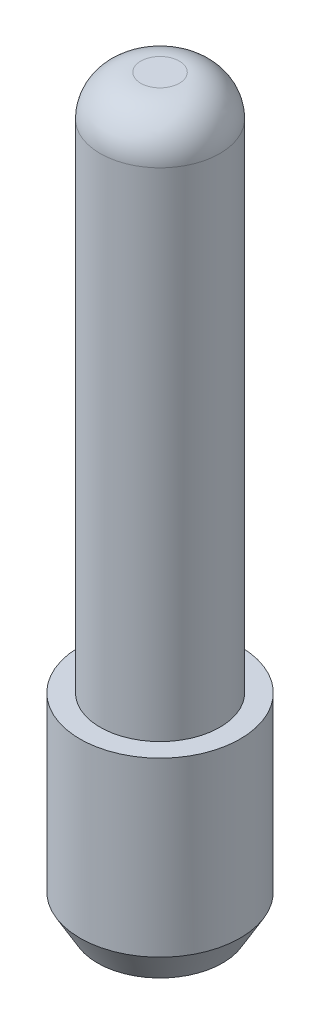
ISO-10303-21;
HEADER;
FILE_DESCRIPTION(('STEP AP214'),'2;1');
FILE_NAME('part.step','',(''),(''),'','','');
FILE_SCHEMA(('AUTOMOTIVE_DESIGN { 1 0 10303 214 1 1 1 1 }'));
ENDSEC;
DATA;
#1=APPLICATION_CONTEXT('core data for automotive mechanical design processes');
#2=APPLICATION_PROTOCOL_DEFINITION('international standard','automotive_design',2000,#1);
#3=PRODUCT_CONTEXT('',#1,'mechanical');
#4=PRODUCT('Part','Part','',(#3));
#5=PRODUCT_RELATED_PRODUCT_CATEGORY('part','',(#4));
#6=PRODUCT_DEFINITION_FORMATION('','',#4);
#7=PRODUCT_DEFINITION_CONTEXT('part definition',#1,'design');
#8=PRODUCT_DEFINITION('design','',#6,#7);
#9=PRODUCT_DEFINITION_SHAPE('','',#8);
#10=(LENGTH_UNIT() NAMED_UNIT(*) SI_UNIT(.MILLI.,.METRE.));
#11=(NAMED_UNIT(*) PLANE_ANGLE_UNIT() SI_UNIT($,.RADIAN.));
#12=(NAMED_UNIT(*) SI_UNIT($,.STERADIAN.) SOLID_ANGLE_UNIT());
#13=UNCERTAINTY_MEASURE_WITH_UNIT(LENGTH_MEASURE(1.E-05),#10,'distance_accuracy_value','');
#14=(GEOMETRIC_REPRESENTATION_CONTEXT(3) GLOBAL_UNCERTAINTY_ASSIGNED_CONTEXT((#13)) GLOBAL_UNIT_ASSIGNED_CONTEXT((#10,
#11,#12)) REPRESENTATION_CONTEXT('',''));
#15=CARTESIAN_POINT('',(0.,0.,0.));
#16=DIRECTION('',(0.,0.,1.));
#17=DIRECTION('',(1.,0.,0.));
#18=AXIS2_PLACEMENT_3D('',#15,#16,#17);
#19=CARTESIAN_POINT('',(0.,0.,0.));
#20=DIRECTION('',(0.,-1.,0.));
#21=DIRECTION('',(0.,0.,-1.));
#22=AXIS2_PLACEMENT_3D('',#19,#20,#21);
#23=PLANE('',#22);
#24=CARTESIAN_POINT('',(0.,0.,0.));
#25=DIRECTION('',(0.,-1.,0.));
#26=DIRECTION('',(0.,0.,-1.));
#27=AXIS2_PLACEMENT_3D('',#24,#25,#26);
#28=CIRCLE('',#27,3.08397459621555);
#29=CARTESIAN_POINT('',(0.,0.,3.08397459621555));
#30=VERTEX_POINT('',#29);
#31=EDGE_CURVE('E39',#30,#30,#28,.T.);
#32=ORIENTED_EDGE('',*,*,#31,.T.);
#33=EDGE_LOOP('',(#32));
#34=FACE_BOUND('',#33,.T.);
#35=ADVANCED_FACE('F32',(#34),#23,.T.);
#36=CARTESIAN_POINT('',(0.,0.,0.));
#37=DIRECTION('',(0.,-1.,0.));
#38=DIRECTION('',(0.,0.,-1.));
#39=AXIS2_PLACEMENT_3D('',#36,#37,#38);
#40=CYLINDRICAL_SURFACE('',#39,3.95);
#41=CARTESIAN_POINT('',(0.,1.50000000000002,0.));
#42=DIRECTION('',(0.,-1.,0.));
#43=DIRECTION('',(0.,0.,-1.));
#44=AXIS2_PLACEMENT_3D('',#41,#42,#43);
#45=CIRCLE('',#44,3.95);
#46=CARTESIAN_POINT('',(0.,1.50000000000002,3.95));
#47=VERTEX_POINT('',#46);
#48=EDGE_CURVE('E10',#47,#47,#45,.F.);
#49=ORIENTED_EDGE('',*,*,#48,.T.);
#50=EDGE_LOOP('',(#49));
#51=FACE_BOUND('',#50,.T.);
#52=CARTESIAN_POINT('',(0.,10.,0.));
#53=DIRECTION('',(0.,-1.,0.));
#54=DIRECTION('',(0.,0.,-1.));
#55=AXIS2_PLACEMENT_3D('',#52,#53,#54);
#56=CIRCLE('',#55,3.95);
#57=CARTESIAN_POINT('',(0.,10.,-3.95));
#58=VERTEX_POINT('',#57);
#59=EDGE_CURVE('E52',#58,#58,#56,.T.);
#60=ORIENTED_EDGE('',*,*,#59,.T.);
#61=EDGE_LOOP('',(#60));
#62=FACE_BOUND('',#61,.T.);
#63=ADVANCED_FACE('F74',(#51,#62),#40,.T.);
#64=CARTESIAN_POINT('',(3.95,10.,0.));
#65=DIRECTION('',(0.,1.,0.));
#66=DIRECTION('',(0.,0.,1.));
#67=AXIS2_PLACEMENT_3D('',#64,#65,#66);
#68=PLANE('',#67);
#69=CARTESIAN_POINT('',(0.,10.,0.));
#70=DIRECTION('',(0.,-1.,0.));
#71=DIRECTION('',(0.,0.,-1.));
#72=AXIS2_PLACEMENT_3D('',#69,#70,#71);
#73=CIRCLE('',#72,2.95);
#74=CARTESIAN_POINT('',(0.,10.,-2.95));
#75=VERTEX_POINT('',#74);
#76=EDGE_CURVE('E55',#75,#75,#73,.T.);
#77=ORIENTED_EDGE('',*,*,#76,.T.);
#78=EDGE_LOOP('',(#77));
#79=FACE_BOUND('',#78,.T.);
#80=ORIENTED_EDGE('',*,*,#59,.F.);
#81=EDGE_LOOP('',(#80));
#82=FACE_BOUND('',#81,.T.);
#83=ADVANCED_FACE('F59',(#79,#82),#68,.T.);
#84=CARTESIAN_POINT('',(0.,0.,0.));
#85=DIRECTION('',(0.,-1.,0.));
#86=DIRECTION('',(0.,0.,-1.));
#87=AXIS2_PLACEMENT_3D('',#84,#85,#86);
#88=CYLINDRICAL_SURFACE('',#87,2.95);
#89=CARTESIAN_POINT('',(0.,34.5,0.));
#90=DIRECTION('',(0.,1.,0.));
#91=DIRECTION('',(0.,0.,1.));
#92=AXIS2_PLACEMENT_3D('',#89,#90,#91);
#93=CIRCLE('',#92,2.95);
#94=CARTESIAN_POINT('',(0.,34.5,2.95));
#95=VERTEX_POINT('',#94);
#96=EDGE_CURVE('E47',#95,#95,#93,.F.);
#97=ORIENTED_EDGE('',*,*,#96,.T.);
#98=EDGE_LOOP('',(#97));
#99=FACE_BOUND('',#98,.T.);
#100=ORIENTED_EDGE('',*,*,#76,.F.);
#101=EDGE_LOOP('',(#100));
#102=FACE_BOUND('',#101,.T.);
#103=ADVANCED_FACE('F62',(#99,#102),#88,.T.);
#104=CARTESIAN_POINT('',(2.95,36.5,0.));
#105=DIRECTION('',(0.,1.,0.));
#106=DIRECTION('',(0.,0.,1.));
#107=AXIS2_PLACEMENT_3D('',#104,#105,#106);
#108=PLANE('',#107);
#109=CARTESIAN_POINT('',(0.,36.5,0.));
#110=DIRECTION('',(0.,1.,0.));
#111=DIRECTION('',(0.,0.,1.));
#112=AXIS2_PLACEMENT_3D('',#109,#110,#111);
#113=CIRCLE('',#112,0.95);
#114=CARTESIAN_POINT('',(0.,36.5,0.95));
#115=VERTEX_POINT('',#114);
#116=EDGE_CURVE('E43',#115,#115,#113,.T.);
#117=ORIENTED_EDGE('',*,*,#116,.T.);
#118=EDGE_LOOP('',(#117));
#119=FACE_BOUND('',#118,.T.);
#120=ADVANCED_FACE('F64',(#119),#108,.T.);
#121=CARTESIAN_POINT('',(0.,34.5,0.));
#122=DIRECTION('',(0.,1.,0.));
#123=DIRECTION('',(0.,0.,1.));
#124=AXIS2_PLACEMENT_3D('',#121,#122,#123);
#125=DEGENERATE_TOROIDAL_SURFACE('',#124,0.95,2.,.T.);
#126=ORIENTED_EDGE('',*,*,#116,.F.);
#127=EDGE_LOOP('',(#126));
#128=FACE_BOUND('',#127,.T.);
#129=ORIENTED_EDGE('',*,*,#96,.F.);
#130=EDGE_LOOP('',(#129));
#131=FACE_BOUND('',#130,.T.);
#132=ADVANCED_FACE('F71',(#128,#131),#125,.T.);
#133=CARTESIAN_POINT('',(0.,0.,0.));
#134=DIRECTION('',(0.,1.,0.));
#135=DIRECTION('',(0.,0.,1.));
#136=AXIS2_PLACEMENT_3D('',#133,#134,#135);
#137=CONICAL_SURFACE('',#136,3.08397459621555,0.523598775598299);
#138=CARTESIAN_POINT('',(0.,1.50000000000002,3.95));
#139=CARTESIAN_POINT('',(0.,1.48437500000002,3.94097890204391));
#140=CARTESIAN_POINT('',(0.,1.46875000000002,3.93195780408782));
#141=CARTESIAN_POINT('',(0.,1.43750000000002,3.91391560817565));
#142=CARTESIAN_POINT('',(0.,1.42187500000002,3.90489451021956));
#143=CARTESIAN_POINT('',(0.,1.39062500000002,3.88685231430738));
#144=CARTESIAN_POINT('',(0.,1.37500000000002,3.8778312163513));
#145=CARTESIAN_POINT('',(0.,1.34375000000002,3.85978902043912));
#146=CARTESIAN_POINT('',(0.,1.32812500000002,3.85076792248303));
#147=CARTESIAN_POINT('',(0.,1.29687500000002,3.83272572657086));
#148=CARTESIAN_POINT('',(0.,1.28125000000002,3.82370462861477));
#149=CARTESIAN_POINT('',(0.,1.25000000000002,3.80566243270259));
#150=CARTESIAN_POINT('',(0.,1.23437500000002,3.7966413347465));
#151=CARTESIAN_POINT('',(0.,1.20312500000002,3.77859913883433));
#152=CARTESIAN_POINT('',(0.,1.18750000000002,3.76957804087824));
#153=CARTESIAN_POINT('',(0.,1.15625000000002,3.75153584496606));
#154=CARTESIAN_POINT('',(0.,1.14062500000002,3.74251474700998));
#155=CARTESIAN_POINT('',(0.,1.10937500000002,3.7244725510978));
#156=CARTESIAN_POINT('',(0.,1.09375000000002,3.71545145314171));
#157=CARTESIAN_POINT('',(0.,1.06250000000002,3.69740925722954));
#158=CARTESIAN_POINT('',(0.,1.04687500000002,3.68838815927345));
#159=CARTESIAN_POINT('',(0.,1.01562500000002,3.67034596336127));
#160=CARTESIAN_POINT('',(0.,1.00000000000002,3.66132486540518));
#161=CARTESIAN_POINT('',(0.,0.968750000000015,3.64328266949301));
#162=CARTESIAN_POINT('',(0.,0.953125000000015,3.63426157153692));
#163=CARTESIAN_POINT('',(0.,0.921875000000014,3.61621937562474));
#164=CARTESIAN_POINT('',(0.,0.906250000000014,3.60719827766866));
#165=CARTESIAN_POINT('',(0.,0.875000000000014,3.58915608175648));
#166=CARTESIAN_POINT('',(0.,0.859375000000013,3.58013498380039));
#167=CARTESIAN_POINT('',(0.,0.828125000000013,3.56209278788821));
#168=CARTESIAN_POINT('',(0.,0.812500000000013,3.55307168993213));
#169=CARTESIAN_POINT('',(0.,0.781250000000012,3.53502949401995));
#170=CARTESIAN_POINT('',(0.,0.765625000000012,3.52600839606386));
#171=CARTESIAN_POINT('',(0.,0.734375000000011,3.50796620015169));
#172=CARTESIAN_POINT('',(0.,0.718750000000011,3.4989451021956));
#173=CARTESIAN_POINT('',(0.,0.687500000000011,3.48090290628342));
#174=CARTESIAN_POINT('',(0.,0.67187500000001,3.47188180832733));
#175=CARTESIAN_POINT('',(0.,0.64062500000001,3.45383961241516));
#176=CARTESIAN_POINT('',(0.,0.62500000000001,3.44481851445907));
#177=CARTESIAN_POINT('',(0.,0.593750000000009,3.42677631854689));
#178=CARTESIAN_POINT('',(0.,0.578125000000009,3.41775522059081));
#179=CARTESIAN_POINT('',(0.,0.546875000000008,3.39971302467863));
#180=CARTESIAN_POINT('',(0.,0.531250000000008,3.39069192672254));
#181=CARTESIAN_POINT('',(0.,0.500000000000008,3.37264973081037));
#182=CARTESIAN_POINT('',(0.,0.484375000000008,3.36362863285428));
#183=CARTESIAN_POINT('',(0.,0.453125000000007,3.3455864369421));
#184=CARTESIAN_POINT('',(0.,0.437500000000007,3.33656533898601));
#185=CARTESIAN_POINT('',(0.,0.406250000000006,3.31852314307384));
#186=CARTESIAN_POINT('',(0.,0.390625000000006,3.30950204511775));
#187=CARTESIAN_POINT('',(0.,0.359375000000006,3.29145984920557));
#188=CARTESIAN_POINT('',(0.,0.343750000000005,3.28243875124949));
#189=CARTESIAN_POINT('',(0.,0.312500000000005,3.26439655533731));
#190=CARTESIAN_POINT('',(0.,0.296875000000004,3.25537545738122));
#191=CARTESIAN_POINT('',(0.,0.265625000000004,3.23733326146905));
#192=CARTESIAN_POINT('',(0.,0.250000000000004,3.22831216351296));
#193=CARTESIAN_POINT('',(0.,0.218750000000003,3.21026996760078));
#194=CARTESIAN_POINT('',(0.,0.203125000000003,3.20124886964469));
#195=CARTESIAN_POINT('',(0.,0.171875000000003,3.18320667373252));
#196=CARTESIAN_POINT('',(0.,0.156250000000002,3.17418557577643));
#197=CARTESIAN_POINT('',(0.,0.125000000000002,3.15614337986425));
#198=CARTESIAN_POINT('',(0.,0.109375000000002,3.14712228190817));
#199=CARTESIAN_POINT('',(0.,0.0781250000000012,3.12908008599599));
#200=CARTESIAN_POINT('',(0.,0.0625000000000009,3.1200589880399));
#201=CARTESIAN_POINT('',(0.,0.0312500000000004,3.10201679212773));
#202=CARTESIAN_POINT('',(0.,0.0156250000000002,3.09299569417164));
#203=CARTESIAN_POINT('',(0.,0.,3.08397459621555));
#204=B_SPLINE_CURVE_WITH_KNOTS('',3,(#138,#139,#140,#141,#142,#143,#144,#145,#146,#147,#148,
#149,#150,#151,#152,#153,#154,#155,#156,#157,#158,#159,#160,#161,#162,#163,#164,#165,#166,#167,
#168,#169,#170,#171,#172,#173,#174,#175,#176,#177,#178,#179,#180,#181,#182,#183,#184,#185,#186,
#187,#188,#189,#190,#191,#192,#193,#194,#195,#196,#197,#198,#199,#200,#201,#202,#203),
.UNSPECIFIED.,.F.,.F.,(4,2,2,2,2,2,2,2,2,2,2,2,2,2,2,2,2,2,2,2,2,2,2,2,2,2,2,2,2,2,2,2,4),(0.,
0.0541265877365281,0.108253175473056,0.162379763209585,0.216506350946113,0.270632938682641,
0.324759526419169,0.378886114155698,0.433012701892226,0.487139289628754,0.541265877365283,
0.595392465101811,0.649519052838339,0.703645640574867,0.757772228311395,0.811898816047924,
0.866025403784452,0.92015199152098,0.974278579257509,1.02840516699404,1.08253175473057,
1.13665834246709,1.19078493020362,1.24491151794015,1.29903810567668,1.35316469341321,
1.40729128114973,1.46141786888626,1.51554445662279,1.56967104435932,1.62379763209585,
1.67792421983238,1.7320508075689),.UNSPECIFIED.);
#205=EDGE_CURVE('BSEAM34',#47,#30,#204,.T.);
#206=ORIENTED_EDGE('',*,*,#48,.F.);
#207=ORIENTED_EDGE('',*,*,#31,.F.);
#208=ORIENTED_EDGE('',*,*,#205,.T.);
#209=ORIENTED_EDGE('',*,*,#205,.F.);
#210=EDGE_LOOP('',(#206,#208,#207,#209));
#211=FACE_BOUND('',#210,.T.);
#212=ADVANCED_FACE('F34',(#211),#137,.T.);
#213=CLOSED_SHELL('',(#35,#63,#83,#103,#120,#132,#212));
#214=MANIFOLD_SOLID_BREP('B2',#213);
#215=ADVANCED_BREP_SHAPE_REPRESENTATION('',(#18,#214),#14);
#216=SHAPE_DEFINITION_REPRESENTATION(#9,#215);
ENDSEC;
END-ISO-10303-21;
